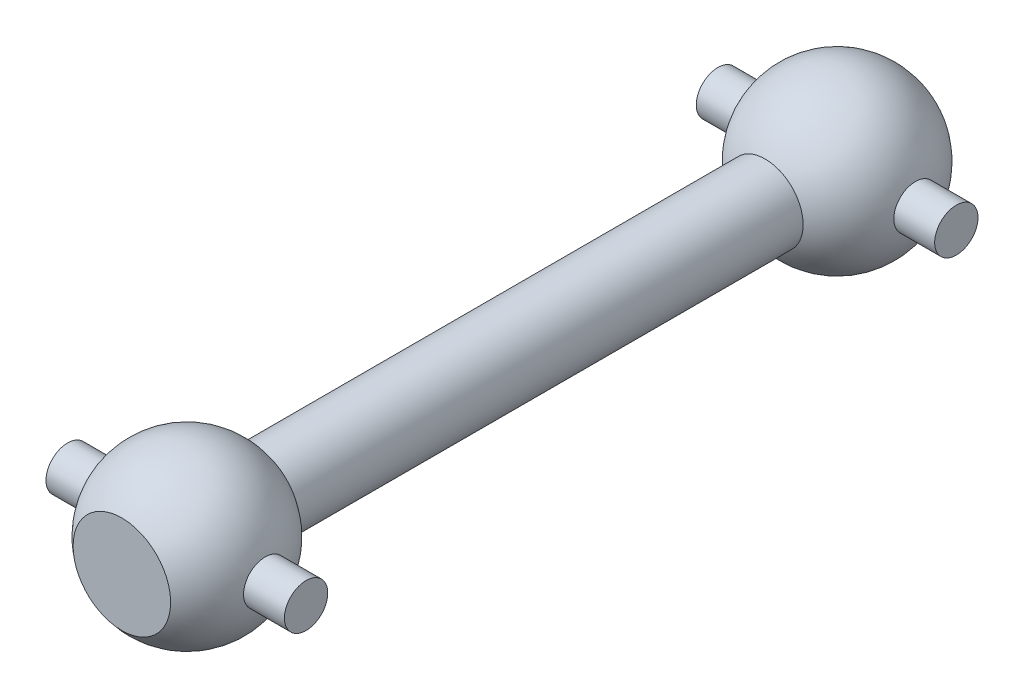
ISO-10303-21;
HEADER;
FILE_DESCRIPTION(('STEP AP214'),'2;1');
FILE_NAME('part.step','',(''),(''),'','','');
FILE_SCHEMA(('AUTOMOTIVE_DESIGN { 1 0 10303 214 1 1 1 1 }'));
ENDSEC;
DATA;
#1=APPLICATION_CONTEXT('core data for automotive mechanical design processes');
#2=APPLICATION_PROTOCOL_DEFINITION('international standard','automotive_design',2000,#1);
#3=PRODUCT_CONTEXT('',#1,'mechanical');
#4=PRODUCT('Part','Part','',(#3));
#5=PRODUCT_RELATED_PRODUCT_CATEGORY('part','',(#4));
#6=PRODUCT_DEFINITION_FORMATION('','',#4);
#7=PRODUCT_DEFINITION_CONTEXT('part definition',#1,'design');
#8=PRODUCT_DEFINITION('design','',#6,#7);
#9=PRODUCT_DEFINITION_SHAPE('','',#8);
#10=(LENGTH_UNIT() NAMED_UNIT(*) SI_UNIT(.MILLI.,.METRE.));
#11=(NAMED_UNIT(*) PLANE_ANGLE_UNIT() SI_UNIT($,.RADIAN.));
#12=(NAMED_UNIT(*) SI_UNIT($,.STERADIAN.) SOLID_ANGLE_UNIT());
#13=UNCERTAINTY_MEASURE_WITH_UNIT(LENGTH_MEASURE(1.E-05),#10,'distance_accuracy_value','');
#14=(GEOMETRIC_REPRESENTATION_CONTEXT(3) GLOBAL_UNCERTAINTY_ASSIGNED_CONTEXT((#13)) GLOBAL_UNIT_ASSIGNED_CONTEXT((#10,
#11,#12)) REPRESENTATION_CONTEXT('',''));
#15=CARTESIAN_POINT('',(0.,0.,0.));
#16=DIRECTION('',(0.,0.,1.));
#17=DIRECTION('',(1.,0.,0.));
#18=AXIS2_PLACEMENT_3D('',#15,#16,#17);
#19=CARTESIAN_POINT('',(0.,0.,25.));
#20=DIRECTION('',(0.,0.,-1.));
#21=DIRECTION('',(-1.,0.,0.));
#22=AXIS2_PLACEMENT_3D('',#19,#20,#21);
#23=CYLINDRICAL_SURFACE('',#22,3.5);
#24=CARTESIAN_POINT('',(0.,0.,-23.3667504192892));
#25=DIRECTION('',(0.,0.,-1.));
#26=DIRECTION('',(-1.,0.,0.));
#27=AXIS2_PLACEMENT_3D('',#24,#25,#26);
#28=CIRCLE('',#27,3.5);
#29=CARTESIAN_POINT('',(-3.5,0.,-23.3667504192892));
#30=VERTEX_POINT('',#29);
#31=EDGE_CURVE('E90',#30,#30,#28,.T.);
#32=ORIENTED_EDGE('',*,*,#31,.F.);
#33=EDGE_LOOP('',(#32));
#34=FACE_BOUND('',#33,.T.);
#35=CARTESIAN_POINT('',(0.,0.,23.3667504192892));
#36=DIRECTION('',(0.,0.,1.));
#37=DIRECTION('',(1.,0.,0.));
#38=AXIS2_PLACEMENT_3D('',#35,#36,#37);
#39=CIRCLE('',#38,3.5);
#40=CARTESIAN_POINT('',(3.5,0.,23.3667504192892));
#41=VERTEX_POINT('',#40);
#42=EDGE_CURVE('E10',#41,#41,#39,.T.);
#43=ORIENTED_EDGE('',*,*,#42,.F.);
#44=EDGE_LOOP('',(#43));
#45=FACE_BOUND('',#44,.T.);
#46=ADVANCED_FACE('F38',(#34,#45),#23,.T.);
#47=CARTESIAN_POINT('',(0.,0.,-30.));
#48=DIRECTION('',(0.,0.,1.));
#49=DIRECTION('',(0.,1.,0.));
#50=AXIS2_PLACEMENT_3D('',#47,#48,#49);
#51=SPHERICAL_SURFACE('',#50,7.5);
#52=CARTESIAN_POINT('',(0.,0.,-36.));
#53=DIRECTION('',(0.,0.,1.));
#54=DIRECTION('',(0.,-1.,0.));
#55=AXIS2_PLACEMENT_3D('',#52,#53,#54);
#56=CIRCLE('',#55,4.5);
#57=CARTESIAN_POINT('',(0.,-4.5,-36.));
#58=VERTEX_POINT('',#57);
#59=EDGE_CURVE('E84',#58,#58,#56,.T.);
#60=ORIENTED_EDGE('',*,*,#59,.T.);
#61=EDGE_LOOP('',(#60));
#62=FACE_BOUND('',#61,.T.);
#63=ORIENTED_EDGE('',*,*,#31,.T.);
#64=EDGE_LOOP('',(#63));
#65=FACE_BOUND('',#64,.T.);
#66=CARTESIAN_POINT('',(7.22841614740047,0.,-30.));
#67=DIRECTION('',(-1.,0.,0.));
#68=DIRECTION('',(0.,0.,1.));
#69=AXIS2_PLACEMENT_3D('',#66,#67,#68);
#70=CIRCLE('',#69,2.00000000000001);
#71=CARTESIAN_POINT('',(7.22841614740047,0.,-28.));
#72=VERTEX_POINT('',#71);
#73=EDGE_CURVE('E54',#72,#72,#70,.F.);
#74=ORIENTED_EDGE('',*,*,#73,.F.);
#75=EDGE_LOOP('',(#74));
#76=FACE_BOUND('',#75,.T.);
#77=CARTESIAN_POINT('',(-7.22841614740047,0.,-30.));
#78=DIRECTION('',(1.,0.,0.));
#79=DIRECTION('',(0.,0.,-1.));
#80=AXIS2_PLACEMENT_3D('',#77,#78,#79);
#81=CIRCLE('',#80,2.00000000000001);
#82=CARTESIAN_POINT('',(-7.22841614740047,0.,-32.));
#83=VERTEX_POINT('',#82);
#84=EDGE_CURVE('E46',#83,#83,#81,.F.);
#85=ORIENTED_EDGE('',*,*,#84,.F.);
#86=EDGE_LOOP('',(#85));
#87=FACE_BOUND('',#86,.T.);
#88=ADVANCED_FACE('F98',(#62,#65,#76,#87),#51,.T.);
#89=CARTESIAN_POINT('',(0.,0.,-36.));
#90=DIRECTION('',(0.,0.,-1.));
#91=DIRECTION('',(0.,1.,0.));
#92=AXIS2_PLACEMENT_3D('',#89,#90,#91);
#93=PLANE('',#92);
#94=ORIENTED_EDGE('',*,*,#59,.F.);
#95=EDGE_LOOP('',(#94));
#96=FACE_BOUND('',#95,.T.);
#97=ADVANCED_FACE('F101',(#96),#93,.T.);
#98=CARTESIAN_POINT('',(11.,0.,-30.));
#99=DIRECTION('',(1.,0.,0.));
#100=DIRECTION('',(0.,0.,-1.));
#101=AXIS2_PLACEMENT_3D('',#98,#99,#100);
#102=PLANE('',#101);
#103=CARTESIAN_POINT('',(11.,0.,-30.));
#104=DIRECTION('',(1.,0.,0.));
#105=DIRECTION('',(0.,0.,-1.));
#106=AXIS2_PLACEMENT_3D('',#103,#104,#105);
#107=CIRCLE('',#106,2.00000000000001);
#108=CARTESIAN_POINT('',(11.,0.,-32.));
#109=VERTEX_POINT('',#108);
#110=EDGE_CURVE('E81',#109,#109,#107,.T.);
#111=ORIENTED_EDGE('',*,*,#110,.T.);
#112=EDGE_LOOP('',(#111));
#113=FACE_BOUND('',#112,.T.);
#114=ADVANCED_FACE('F118',(#113),#102,.T.);
#115=CARTESIAN_POINT('',(11.,0.,-30.));
#116=DIRECTION('',(-1.,0.,0.));
#117=DIRECTION('',(0.,0.,1.));
#118=AXIS2_PLACEMENT_3D('',#115,#116,#117);
#119=CYLINDRICAL_SURFACE('',#118,2.00000000000001);
#120=ORIENTED_EDGE('',*,*,#110,.F.);
#121=EDGE_LOOP('',(#120));
#122=FACE_BOUND('',#121,.T.);
#123=ORIENTED_EDGE('',*,*,#73,.T.);
#124=EDGE_LOOP('',(#123));
#125=FACE_BOUND('',#124,.T.);
#126=ADVANCED_FACE('F96',(#122,#125),#119,.T.);
#127=CARTESIAN_POINT('',(-11.,0.,-30.));
#128=DIRECTION('',(1.,0.,0.));
#129=DIRECTION('',(0.,0.,-1.));
#130=AXIS2_PLACEMENT_3D('',#127,#128,#129);
#131=CIRCLE('',#130,2.00000000000001);
#132=CARTESIAN_POINT('',(-11.,0.,-32.));
#133=VERTEX_POINT('',#132);
#134=EDGE_CURVE('E80',#133,#133,#131,.T.);
#135=ORIENTED_EDGE('',*,*,#134,.T.);
#136=EDGE_LOOP('',(#135));
#137=FACE_BOUND('',#136,.T.);
#138=ORIENTED_EDGE('',*,*,#84,.T.);
#139=EDGE_LOOP('',(#138));
#140=FACE_BOUND('',#139,.T.);
#141=ADVANCED_FACE('F106',(#137,#140),#119,.T.);
#142=CARTESIAN_POINT('',(-11.,0.,-30.));
#143=DIRECTION('',(1.,0.,0.));
#144=DIRECTION('',(0.,0.,-1.));
#145=AXIS2_PLACEMENT_3D('',#142,#143,#144);
#146=PLANE('',#145);
#147=ORIENTED_EDGE('',*,*,#134,.F.);
#148=EDGE_LOOP('',(#147));
#149=FACE_BOUND('',#148,.T.);
#150=ADVANCED_FACE('F108',(#149),#146,.F.);
#151=CARTESIAN_POINT('',(0.,0.,30.));
#152=DIRECTION('',(0.,0.,-1.));
#153=DIRECTION('',(0.,1.,0.));
#154=AXIS2_PLACEMENT_3D('',#151,#152,#153);
#155=SPHERICAL_SURFACE('',#154,7.5);
#156=CARTESIAN_POINT('',(-7.22841614740047,0.,30.));
#157=DIRECTION('',(1.,0.,0.));
#158=DIRECTION('',(0.,0.,-1.));
#159=AXIS2_PLACEMENT_3D('',#156,#157,#158);
#160=CIRCLE('',#159,2.00000000000001);
#161=CARTESIAN_POINT('',(-7.22841614740047,0.,28.));
#162=VERTEX_POINT('',#161);
#163=EDGE_CURVE('E41',#162,#162,#160,.T.);
#164=ORIENTED_EDGE('',*,*,#163,.T.);
#165=EDGE_LOOP('',(#164));
#166=FACE_BOUND('',#165,.T.);
#167=CARTESIAN_POINT('',(7.22841614740047,0.,30.));
#168=DIRECTION('',(-1.,0.,0.));
#169=DIRECTION('',(0.,0.,1.));
#170=AXIS2_PLACEMENT_3D('',#167,#168,#169);
#171=CIRCLE('',#170,2.00000000000001);
#172=CARTESIAN_POINT('',(7.22841614740047,0.,32.));
#173=VERTEX_POINT('',#172);
#174=EDGE_CURVE('E57',#173,#173,#171,.T.);
#175=ORIENTED_EDGE('',*,*,#174,.T.);
#176=EDGE_LOOP('',(#175));
#177=FACE_BOUND('',#176,.T.);
#178=CARTESIAN_POINT('',(0.,0.,36.));
#179=DIRECTION('',(0.,0.,1.));
#180=DIRECTION('',(0.,-1.,0.));
#181=AXIS2_PLACEMENT_3D('',#178,#179,#180);
#182=CIRCLE('',#181,4.5);
#183=CARTESIAN_POINT('',(0.,-4.5,36.));
#184=VERTEX_POINT('',#183);
#185=EDGE_CURVE('E67',#184,#184,#182,.T.);
#186=ORIENTED_EDGE('',*,*,#185,.F.);
#187=EDGE_LOOP('',(#186));
#188=FACE_BOUND('',#187,.T.);
#189=ORIENTED_EDGE('',*,*,#42,.T.);
#190=EDGE_LOOP('',(#189));
#191=FACE_BOUND('',#190,.T.);
#192=ADVANCED_FACE('F115',(#166,#177,#188,#191),#155,.T.);
#193=CARTESIAN_POINT('',(0.,0.,36.));
#194=DIRECTION('',(0.,0.,1.));
#195=DIRECTION('',(0.,1.,0.));
#196=AXIS2_PLACEMENT_3D('',#193,#194,#195);
#197=PLANE('',#196);
#198=ORIENTED_EDGE('',*,*,#185,.T.);
#199=EDGE_LOOP('',(#198));
#200=FACE_BOUND('',#199,.T.);
#201=ADVANCED_FACE('F159',(#200),#197,.T.);
#202=CARTESIAN_POINT('',(11.,0.,30.));
#203=DIRECTION('',(1.,0.,0.));
#204=DIRECTION('',(0.,0.,1.));
#205=AXIS2_PLACEMENT_3D('',#202,#203,#204);
#206=PLANE('',#205);
#207=CARTESIAN_POINT('',(11.,0.,30.));
#208=DIRECTION('',(-1.,0.,0.));
#209=DIRECTION('',(0.,0.,1.));
#210=AXIS2_PLACEMENT_3D('',#207,#208,#209);
#211=CIRCLE('',#210,2.00000000000001);
#212=CARTESIAN_POINT('',(11.,0.,32.));
#213=VERTEX_POINT('',#212);
#214=EDGE_CURVE('E60',#213,#213,#211,.T.);
#215=ORIENTED_EDGE('',*,*,#214,.F.);
#216=EDGE_LOOP('',(#215));
#217=FACE_BOUND('',#216,.T.);
#218=ADVANCED_FACE('F168',(#217),#206,.T.);
#219=CARTESIAN_POINT('',(11.,0.,30.));
#220=DIRECTION('',(-1.,0.,0.));
#221=DIRECTION('',(0.,0.,1.));
#222=AXIS2_PLACEMENT_3D('',#219,#220,#221);
#223=CYLINDRICAL_SURFACE('',#222,2.00000000000001);
#224=ORIENTED_EDGE('',*,*,#214,.T.);
#225=EDGE_LOOP('',(#224));
#226=FACE_BOUND('',#225,.T.);
#227=ORIENTED_EDGE('',*,*,#174,.F.);
#228=EDGE_LOOP('',(#227));
#229=FACE_BOUND('',#228,.T.);
#230=ADVANCED_FACE('F177',(#226,#229),#223,.T.);
#231=CARTESIAN_POINT('',(-11.,0.,30.));
#232=DIRECTION('',(-1.,0.,0.));
#233=DIRECTION('',(0.,0.,1.));
#234=AXIS2_PLACEMENT_3D('',#231,#232,#233);
#235=CIRCLE('',#234,2.00000000000001);
#236=CARTESIAN_POINT('',(-11.,0.,32.));
#237=VERTEX_POINT('',#236);
#238=EDGE_CURVE('E70',#237,#237,#235,.T.);
#239=ORIENTED_EDGE('',*,*,#238,.F.);
#240=EDGE_LOOP('',(#239));
#241=FACE_BOUND('',#240,.T.);
#242=ORIENTED_EDGE('',*,*,#163,.F.);
#243=EDGE_LOOP('',(#242));
#244=FACE_BOUND('',#243,.T.);
#245=ADVANCED_FACE('F186',(#241,#244),#223,.T.);
#246=CARTESIAN_POINT('',(-11.,0.,30.));
#247=DIRECTION('',(1.,0.,0.));
#248=DIRECTION('',(0.,0.,1.));
#249=AXIS2_PLACEMENT_3D('',#246,#247,#248);
#250=PLANE('',#249);
#251=ORIENTED_EDGE('',*,*,#238,.T.);
#252=EDGE_LOOP('',(#251));
#253=FACE_BOUND('',#252,.T.);
#254=ADVANCED_FACE('F194',(#253),#250,.F.);
#255=CLOSED_SHELL('',(#46,#88,#97,#114,#126,#141,#150,#192,#201,#218,#230,#245,#254));
#256=MANIFOLD_SOLID_BREP('B2',#255);
#257=ADVANCED_BREP_SHAPE_REPRESENTATION('',(#18,#256),#14);
#258=SHAPE_DEFINITION_REPRESENTATION(#9,#257);
ENDSEC;
END-ISO-10303-21;
